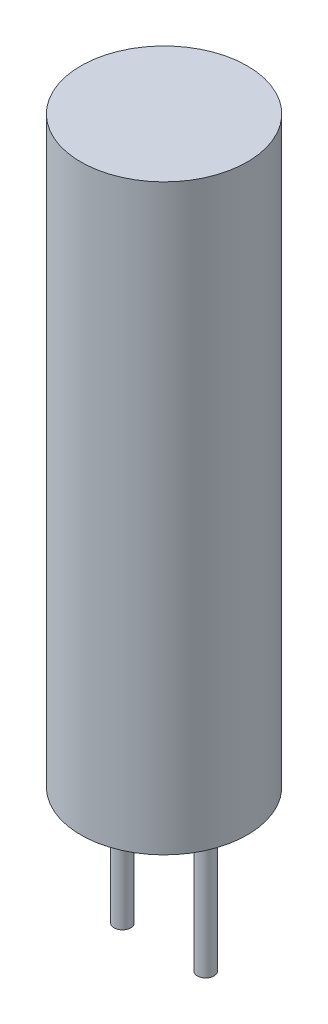
ISO-10303-21;
HEADER;
FILE_DESCRIPTION(('STEP AP214'),'2;1');
FILE_NAME('part.step','',(''),(''),'','','');
FILE_SCHEMA(('AUTOMOTIVE_DESIGN { 1 0 10303 214 1 1 1 1 }'));
ENDSEC;
DATA;
#1=APPLICATION_CONTEXT('core data for automotive mechanical design processes');
#2=APPLICATION_PROTOCOL_DEFINITION('international standard','automotive_design',2000,#1);
#3=PRODUCT_CONTEXT('',#1,'mechanical');
#4=PRODUCT('Part','Part','',(#3));
#5=PRODUCT_RELATED_PRODUCT_CATEGORY('part','',(#4));
#6=PRODUCT_DEFINITION_FORMATION('','',#4);
#7=PRODUCT_DEFINITION_CONTEXT('part definition',#1,'design');
#8=PRODUCT_DEFINITION('design','',#6,#7);
#9=PRODUCT_DEFINITION_SHAPE('','',#8);
#10=(LENGTH_UNIT() NAMED_UNIT(*) SI_UNIT(.MILLI.,.METRE.));
#11=(NAMED_UNIT(*) PLANE_ANGLE_UNIT() SI_UNIT($,.RADIAN.));
#12=(NAMED_UNIT(*) SI_UNIT($,.STERADIAN.) SOLID_ANGLE_UNIT());
#13=UNCERTAINTY_MEASURE_WITH_UNIT(LENGTH_MEASURE(1.E-05),#10,'distance_accuracy_value','');
#14=(GEOMETRIC_REPRESENTATION_CONTEXT(3) GLOBAL_UNCERTAINTY_ASSIGNED_CONTEXT((#13)) GLOBAL_UNIT_ASSIGNED_CONTEXT((#10,
#11,#12)) REPRESENTATION_CONTEXT('',''));
#15=CARTESIAN_POINT('',(0.,0.,0.));
#16=DIRECTION('',(0.,0.,1.));
#17=DIRECTION('',(1.,0.,0.));
#18=AXIS2_PLACEMENT_3D('',#15,#16,#17);
#19=CARTESIAN_POINT('',(0.,52.,0.));
#20=DIRECTION('',(0.,-1.,0.));
#21=DIRECTION('',(0.,0.,-1.));
#22=AXIS2_PLACEMENT_3D('',#19,#20,#21);
#23=CYLINDRICAL_SURFACE('',#22,6.);
#24=CARTESIAN_POINT('',(0.,52.,0.));
#25=DIRECTION('',(0.,1.,0.));
#26=DIRECTION('',(0.,0.,1.));
#27=AXIS2_PLACEMENT_3D('',#24,#25,#26);
#28=CIRCLE('',#27,6.);
#29=CARTESIAN_POINT('',(0.,52.,-6.));
#30=VERTEX_POINT('',#29);
#31=EDGE_CURVE('E11',#30,#30,#28,.T.);
#32=CARTESIAN_POINT('',(0.,10.,0.));
#33=DIRECTION('',(0.,1.,0.));
#34=DIRECTION('',(0.,0.,1.));
#35=AXIS2_PLACEMENT_3D('',#32,#33,#34);
#36=CIRCLE('',#35,6.);
#37=CARTESIAN_POINT('',(0.,10.,-6.));
#38=VERTEX_POINT('',#37);
#39=EDGE_CURVE('E60',#38,#38,#36,.T.);
#40=CARTESIAN_POINT('',(0.,52.,-6.));
#41=CARTESIAN_POINT('',(0.,51.5625,-6.));
#42=CARTESIAN_POINT('',(0.,51.125,-6.));
#43=CARTESIAN_POINT('',(0.,50.25,-6.));
#44=CARTESIAN_POINT('',(0.,49.8125,-6.));
#45=CARTESIAN_POINT('',(0.,48.9375,-6.));
#46=CARTESIAN_POINT('',(0.,48.5,-6.));
#47=CARTESIAN_POINT('',(0.,47.625,-6.));
#48=CARTESIAN_POINT('',(0.,47.1875,-6.));
#49=CARTESIAN_POINT('',(0.,46.3125,-6.));
#50=CARTESIAN_POINT('',(0.,45.875,-6.));
#51=CARTESIAN_POINT('',(0.,45.,-6.));
#52=CARTESIAN_POINT('',(0.,44.5625,-6.));
#53=CARTESIAN_POINT('',(0.,43.6875,-6.));
#54=CARTESIAN_POINT('',(0.,43.25,-6.));
#55=CARTESIAN_POINT('',(0.,42.375,-6.));
#56=CARTESIAN_POINT('',(0.,41.9375,-6.));
#57=CARTESIAN_POINT('',(0.,41.0625,-6.));
#58=CARTESIAN_POINT('',(0.,40.625,-6.));
#59=CARTESIAN_POINT('',(0.,39.75,-6.));
#60=CARTESIAN_POINT('',(0.,39.3125,-6.));
#61=CARTESIAN_POINT('',(0.,38.4375,-6.));
#62=CARTESIAN_POINT('',(0.,38.,-6.));
#63=CARTESIAN_POINT('',(0.,37.125,-6.));
#64=CARTESIAN_POINT('',(0.,36.6875,-6.));
#65=CARTESIAN_POINT('',(0.,35.8125,-6.));
#66=CARTESIAN_POINT('',(0.,35.375,-6.));
#67=CARTESIAN_POINT('',(0.,34.5,-6.));
#68=CARTESIAN_POINT('',(0.,34.0625,-6.));
#69=CARTESIAN_POINT('',(0.,33.1875,-6.));
#70=CARTESIAN_POINT('',(0.,32.75,-6.));
#71=CARTESIAN_POINT('',(0.,31.875,-6.));
#72=CARTESIAN_POINT('',(0.,31.4375,-6.));
#73=CARTESIAN_POINT('',(0.,30.5625,-6.));
#74=CARTESIAN_POINT('',(0.,30.125,-6.));
#75=CARTESIAN_POINT('',(0.,29.25,-6.));
#76=CARTESIAN_POINT('',(0.,28.8125,-6.));
#77=CARTESIAN_POINT('',(0.,27.9375,-6.));
#78=CARTESIAN_POINT('',(0.,27.5,-6.));
#79=CARTESIAN_POINT('',(0.,26.625,-6.));
#80=CARTESIAN_POINT('',(0.,26.1875,-6.));
#81=CARTESIAN_POINT('',(0.,25.3125,-6.));
#82=CARTESIAN_POINT('',(0.,24.875,-6.));
#83=CARTESIAN_POINT('',(0.,24.,-6.));
#84=CARTESIAN_POINT('',(0.,23.5625,-6.));
#85=CARTESIAN_POINT('',(0.,22.6875,-6.));
#86=CARTESIAN_POINT('',(0.,22.25,-6.));
#87=CARTESIAN_POINT('',(0.,21.375,-6.));
#88=CARTESIAN_POINT('',(0.,20.9375,-6.));
#89=CARTESIAN_POINT('',(0.,20.0625,-6.));
#90=CARTESIAN_POINT('',(0.,19.625,-6.));
#91=CARTESIAN_POINT('',(0.,18.75,-6.));
#92=CARTESIAN_POINT('',(0.,18.3125,-6.));
#93=CARTESIAN_POINT('',(0.,17.4375,-6.));
#94=CARTESIAN_POINT('',(0.,17.,-6.));
#95=CARTESIAN_POINT('',(0.,16.125,-6.));
#96=CARTESIAN_POINT('',(0.,15.6875,-6.));
#97=CARTESIAN_POINT('',(0.,14.8125,-6.));
#98=CARTESIAN_POINT('',(0.,14.375,-6.));
#99=CARTESIAN_POINT('',(0.,13.5,-6.));
#100=CARTESIAN_POINT('',(0.,13.0625,-6.));
#101=CARTESIAN_POINT('',(0.,12.1875,-6.));
#102=CARTESIAN_POINT('',(0.,11.75,-6.));
#103=CARTESIAN_POINT('',(0.,10.875,-6.));
#104=CARTESIAN_POINT('',(0.,10.4375,-6.));
#105=CARTESIAN_POINT('',(0.,10.,-6.));
#106=B_SPLINE_CURVE_WITH_KNOTS('',3,(#40,#41,#42,#43,#44,#45,#46,#47,#48,#49,#50,#51,#52,#53,
#54,#55,#56,#57,#58,#59,#60,#61,#62,#63,#64,#65,#66,#67,#68,#69,#70,#71,#72,#73,#74,#75,#76,#77,
#78,#79,#80,#81,#82,#83,#84,#85,#86,#87,#88,#89,#90,#91,#92,#93,#94,#95,#96,#97,#98,#99,#100,
#101,#102,#103,#104,#105),.UNSPECIFIED.,.F.,.F.,(4,2,2,2,2,2,2,2,2,2,2,2,2,2,2,2,2,2,2,2,2,2,2,
2,2,2,2,2,2,2,2,2,4),(0.,1.31249999999999,2.625,3.9375,5.25,6.5625,7.87499999999999,
9.18749999999999,10.5,11.8125,13.125,14.4375,15.75,17.0625,18.375,19.6875,21.,22.3125,23.625,
24.9375,26.25,27.5625,28.875,30.1875,31.5,32.8125,34.125,35.4375,36.75,38.0625,39.375,40.6875,
42.),.UNSPECIFIED.);
#107=EDGE_CURVE('BSEAM53',#30,#38,#106,.T.);
#108=ORIENTED_EDGE('',*,*,#31,.F.);
#109=ORIENTED_EDGE('',*,*,#39,.T.);
#110=ORIENTED_EDGE('',*,*,#107,.T.);
#111=ORIENTED_EDGE('',*,*,#107,.F.);
#112=EDGE_LOOP('',(#108,#110,#109,#111));
#113=FACE_BOUND('',#112,.T.);
#114=ADVANCED_FACE('F53',(#113),#23,.T.);
#115=CARTESIAN_POINT('',(0.,52.,0.));
#116=DIRECTION('',(0.,1.,0.));
#117=DIRECTION('',(0.,0.,1.));
#118=AXIS2_PLACEMENT_3D('',#115,#116,#117);
#119=PLANE('',#118);
#120=ORIENTED_EDGE('',*,*,#31,.T.);
#121=EDGE_LOOP('',(#120));
#122=FACE_BOUND('',#121,.T.);
#123=ADVANCED_FACE('F69',(#122),#119,.T.);
#124=CARTESIAN_POINT('',(0.,10.,0.));
#125=DIRECTION('',(0.,1.,0.));
#126=DIRECTION('',(0.,0.,1.));
#127=AXIS2_PLACEMENT_3D('',#124,#125,#126);
#128=PLANE('',#127);
#129=ORIENTED_EDGE('',*,*,#39,.F.);
#130=EDGE_LOOP('',(#129));
#131=FACE_BOUND('',#130,.T.);
#132=ADVANCED_FACE('F70',(#131),#128,.F.);
#133=CLOSED_SHELL('',(#114,#123,#132));
#134=MANIFOLD_SOLID_BREP('B2',#133);
#135=CARTESIAN_POINT('',(3.,10.,0.));
#136=DIRECTION('',(0.,-1.,0.));
#137=DIRECTION('',(0.,0.,-1.));
#138=AXIS2_PLACEMENT_3D('',#135,#136,#137);
#139=CYLINDRICAL_SURFACE('',#138,0.6);
#140=CARTESIAN_POINT('',(3.,10.,0.));
#141=DIRECTION('',(0.,1.,0.));
#142=DIRECTION('',(0.,0.,1.));
#143=AXIS2_PLACEMENT_3D('',#140,#141,#142);
#144=CIRCLE('',#143,0.6);
#145=CARTESIAN_POINT('',(3.,10.,0.6));
#146=VERTEX_POINT('',#145);
#147=EDGE_CURVE('E120',#146,#146,#144,.T.);
#148=ORIENTED_EDGE('',*,*,#147,.F.);
#149=EDGE_LOOP('',(#148));
#150=FACE_BOUND('',#149,.T.);
#151=CARTESIAN_POINT('',(3.,0.,0.));
#152=DIRECTION('',(0.,1.,0.));
#153=DIRECTION('',(0.,0.,1.));
#154=AXIS2_PLACEMENT_3D('',#151,#152,#153);
#155=CIRCLE('',#154,0.6);
#156=CARTESIAN_POINT('',(3.,0.,0.6));
#157=VERTEX_POINT('',#156);
#158=EDGE_CURVE('E52',#157,#157,#155,.T.);
#159=ORIENTED_EDGE('',*,*,#158,.T.);
#160=EDGE_LOOP('',(#159));
#161=FACE_BOUND('',#160,.T.);
#162=ADVANCED_FACE('F111',(#150,#161),#139,.T.);
#163=CARTESIAN_POINT('',(3.,10.,0.));
#164=DIRECTION('',(0.,1.,0.));
#165=DIRECTION('',(0.,0.,1.));
#166=AXIS2_PLACEMENT_3D('',#163,#164,#165);
#167=PLANE('',#166);
#168=ORIENTED_EDGE('',*,*,#147,.T.);
#169=EDGE_LOOP('',(#168));
#170=FACE_BOUND('',#169,.T.);
#171=ADVANCED_FACE('F119',(#170),#167,.T.);
#172=CARTESIAN_POINT('',(3.,0.,0.));
#173=DIRECTION('',(0.,1.,0.));
#174=DIRECTION('',(0.,0.,1.));
#175=AXIS2_PLACEMENT_3D('',#172,#173,#174);
#176=PLANE('',#175);
#177=ORIENTED_EDGE('',*,*,#158,.F.);
#178=EDGE_LOOP('',(#177));
#179=FACE_BOUND('',#178,.T.);
#180=ADVANCED_FACE('F135',(#179),#176,.F.);
#181=CLOSED_SHELL('',(#162,#171,#180));
#182=MANIFOLD_SOLID_BREP('B6',#181);
#183=CARTESIAN_POINT('',(-3.,10.,0.));
#184=DIRECTION('',(0.,-1.,0.));
#185=DIRECTION('',(0.,0.,-1.));
#186=AXIS2_PLACEMENT_3D('',#183,#184,#185);
#187=CYLINDRICAL_SURFACE('',#186,0.6);
#188=CARTESIAN_POINT('',(-3.,10.,0.));
#189=DIRECTION('',(0.,1.,0.));
#190=DIRECTION('',(0.,0.,1.));
#191=AXIS2_PLACEMENT_3D('',#188,#189,#190);
#192=CIRCLE('',#191,0.6);
#193=CARTESIAN_POINT('',(-3.,10.,0.6));
#194=VERTEX_POINT('',#193);
#195=EDGE_CURVE('E114',#194,#194,#192,.T.);
#196=ORIENTED_EDGE('',*,*,#195,.F.);
#197=EDGE_LOOP('',(#196));
#198=FACE_BOUND('',#197,.T.);
#199=CARTESIAN_POINT('',(-3.,0.,0.));
#200=DIRECTION('',(0.,1.,0.));
#201=DIRECTION('',(0.,0.,1.));
#202=AXIS2_PLACEMENT_3D('',#199,#200,#201);
#203=CIRCLE('',#202,0.6);
#204=CARTESIAN_POINT('',(-3.,0.,0.6));
#205=VERTEX_POINT('',#204);
#206=EDGE_CURVE('E168',#205,#205,#203,.T.);
#207=ORIENTED_EDGE('',*,*,#206,.T.);
#208=EDGE_LOOP('',(#207));
#209=FACE_BOUND('',#208,.T.);
#210=ADVANCED_FACE('F170',(#198,#209),#187,.T.);
#211=CARTESIAN_POINT('',(-3.,10.,0.));
#212=DIRECTION('',(0.,1.,0.));
#213=DIRECTION('',(0.,0.,1.));
#214=AXIS2_PLACEMENT_3D('',#211,#212,#213);
#215=PLANE('',#214);
#216=ORIENTED_EDGE('',*,*,#195,.T.);
#217=EDGE_LOOP('',(#216));
#218=FACE_BOUND('',#217,.T.);
#219=ADVANCED_FACE('F185',(#218),#215,.T.);
#220=CARTESIAN_POINT('',(-3.,0.,0.));
#221=DIRECTION('',(0.,1.,0.));
#222=DIRECTION('',(0.,0.,1.));
#223=AXIS2_PLACEMENT_3D('',#220,#221,#222);
#224=PLANE('',#223);
#225=ORIENTED_EDGE('',*,*,#206,.F.);
#226=EDGE_LOOP('',(#225));
#227=FACE_BOUND('',#226,.T.);
#228=ADVANCED_FACE('F176',(#227),#224,.F.);
#229=CLOSED_SHELL('',(#210,#219,#228));
#230=MANIFOLD_SOLID_BREP('B48',#229);
#231=ADVANCED_BREP_SHAPE_REPRESENTATION('',(#18,#134,#182,#230),#14);
#232=SHAPE_DEFINITION_REPRESENTATION(#9,#231);
ENDSEC;
END-ISO-10303-21;
